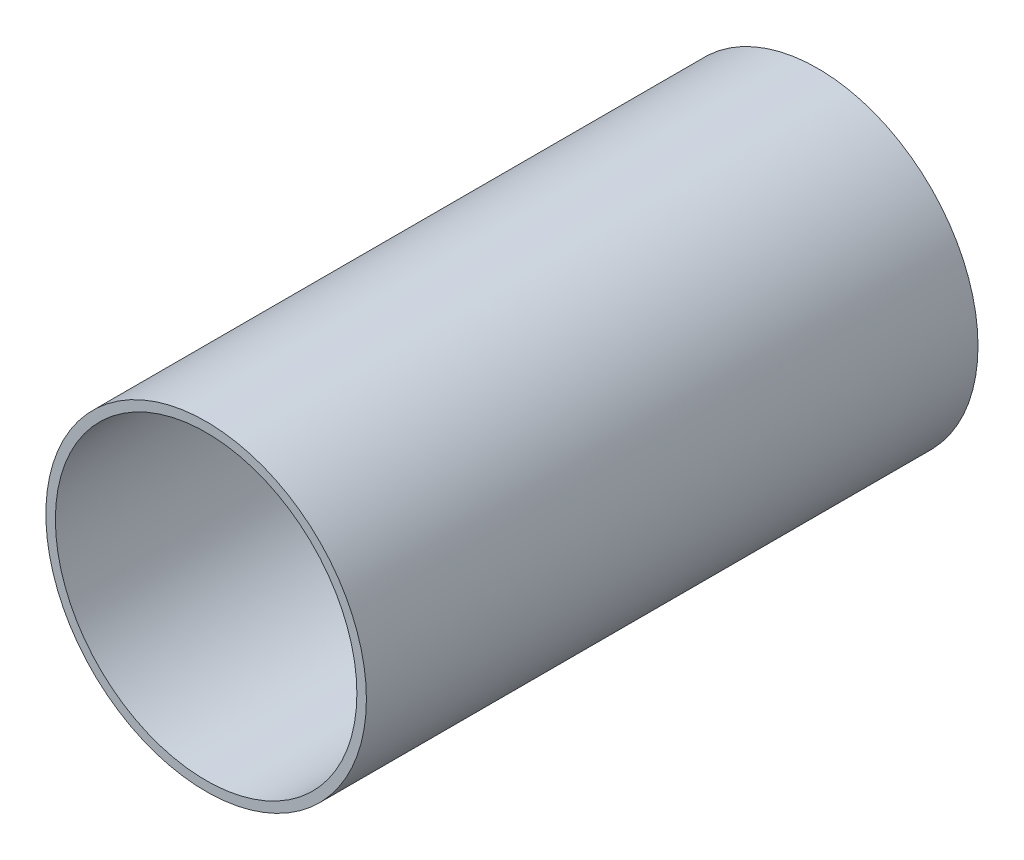
ISO-10303-21;
HEADER;
FILE_DESCRIPTION(('STEP AP214'),'2;1');
FILE_NAME('part.step','',(''),(''),'','','');
FILE_SCHEMA(('AUTOMOTIVE_DESIGN { 1 0 10303 214 1 1 1 1 }'));
ENDSEC;
DATA;
#1=APPLICATION_CONTEXT('core data for automotive mechanical design processes');
#2=APPLICATION_PROTOCOL_DEFINITION('international standard','automotive_design',2000,#1);
#3=PRODUCT_CONTEXT('',#1,'mechanical');
#4=PRODUCT('Part','Part','',(#3));
#5=PRODUCT_RELATED_PRODUCT_CATEGORY('part','',(#4));
#6=PRODUCT_DEFINITION_FORMATION('','',#4);
#7=PRODUCT_DEFINITION_CONTEXT('part definition',#1,'design');
#8=PRODUCT_DEFINITION('design','',#6,#7);
#9=PRODUCT_DEFINITION_SHAPE('','',#8);
#10=(LENGTH_UNIT() NAMED_UNIT(*) SI_UNIT(.MILLI.,.METRE.));
#11=(NAMED_UNIT(*) PLANE_ANGLE_UNIT() SI_UNIT($,.RADIAN.));
#12=(NAMED_UNIT(*) SI_UNIT($,.STERADIAN.) SOLID_ANGLE_UNIT());
#13=UNCERTAINTY_MEASURE_WITH_UNIT(LENGTH_MEASURE(1.E-05),#10,'distance_accuracy_value','');
#14=(GEOMETRIC_REPRESENTATION_CONTEXT(3) GLOBAL_UNCERTAINTY_ASSIGNED_CONTEXT((#13)) GLOBAL_UNIT_ASSIGNED_CONTEXT((#10,
#11,#12)) REPRESENTATION_CONTEXT('',''));
#15=CARTESIAN_POINT('',(0.,0.,0.));
#16=DIRECTION('',(0.,0.,1.));
#17=DIRECTION('',(1.,0.,0.));
#18=AXIS2_PLACEMENT_3D('',#15,#16,#17);
#19=CARTESIAN_POINT('',(0.,0.,0.));
#20=DIRECTION('',(0.,0.,1.));
#21=DIRECTION('',(1.,0.,0.));
#22=AXIS2_PLACEMENT_3D('',#19,#20,#21);
#23=CYLINDRICAL_SURFACE('',#22,47.499999996);
#24=CARTESIAN_POINT('',(0.,0.,192.6999999942));
#25=DIRECTION('',(0.,0.,1.));
#26=DIRECTION('',(1.,0.,0.));
#27=AXIS2_PLACEMENT_3D('',#24,#25,#26);
#28=CIRCLE('',#27,47.499999996);
#29=CARTESIAN_POINT('',(47.499999996,0.,192.6999999942));
#30=VERTEX_POINT('',#29);
#31=EDGE_CURVE('E18',#30,#30,#28,.F.);
#32=ORIENTED_EDGE('',*,*,#31,.F.);
#33=EDGE_LOOP('',(#32));
#34=FACE_BOUND('',#33,.T.);
#35=CARTESIAN_POINT('',(0.,0.,0.));
#36=DIRECTION('',(0.,0.,1.));
#37=DIRECTION('',(1.,0.,0.));
#38=AXIS2_PLACEMENT_3D('',#35,#36,#37);
#39=CIRCLE('',#38,47.499999996);
#40=CARTESIAN_POINT('',(47.499999996,0.,0.));
#41=VERTEX_POINT('',#40);
#42=EDGE_CURVE('E27',#41,#41,#39,.T.);
#43=ORIENTED_EDGE('',*,*,#42,.F.);
#44=EDGE_LOOP('',(#43));
#45=FACE_BOUND('',#44,.T.);
#46=ADVANCED_FACE('F14',(#34,#45),#23,.F.);
#47=CARTESIAN_POINT('',(-51.1059999976,-51.1059999976,192.6999999942));
#48=DIRECTION('',(0.,0.,1.));
#49=DIRECTION('',(1.,0.,0.));
#50=AXIS2_PLACEMENT_3D('',#47,#48,#49);
#51=PLANE('',#50);
#52=ORIENTED_EDGE('',*,*,#31,.T.);
#53=EDGE_LOOP('',(#52));
#54=FACE_BOUND('',#53,.T.);
#55=CARTESIAN_POINT('',(0.,0.,192.6999999942));
#56=DIRECTION('',(0.,0.,1.));
#57=DIRECTION('',(1.,0.,0.));
#58=AXIS2_PLACEMENT_3D('',#55,#56,#57);
#59=CIRCLE('',#58,50.4999999904);
#60=CARTESIAN_POINT('',(50.4999999904,0.,192.6999999942));
#61=VERTEX_POINT('',#60);
#62=EDGE_CURVE('E22',#61,#61,#59,.T.);
#63=ORIENTED_EDGE('',*,*,#62,.T.);
#64=EDGE_LOOP('',(#63));
#65=FACE_BOUND('',#64,.T.);
#66=ADVANCED_FACE('F35',(#54,#65),#51,.T.);
#67=CARTESIAN_POINT('',(51.1059999976,-51.1059999976,0.));
#68=DIRECTION('',(0.,0.,-1.));
#69=DIRECTION('',(-1.,0.,0.));
#70=AXIS2_PLACEMENT_3D('',#67,#68,#69);
#71=PLANE('',#70);
#72=ORIENTED_EDGE('',*,*,#42,.T.);
#73=EDGE_LOOP('',(#72));
#74=FACE_BOUND('',#73,.T.);
#75=CARTESIAN_POINT('',(0.,0.,0.));
#76=DIRECTION('',(0.,0.,1.));
#77=DIRECTION('',(1.,0.,0.));
#78=AXIS2_PLACEMENT_3D('',#75,#76,#77);
#79=CIRCLE('',#78,50.4999999904);
#80=CARTESIAN_POINT('',(50.4999999904,0.,0.));
#81=VERTEX_POINT('',#80);
#82=EDGE_CURVE('E10',#81,#81,#79,.F.);
#83=ORIENTED_EDGE('',*,*,#82,.T.);
#84=EDGE_LOOP('',(#83));
#85=FACE_BOUND('',#84,.T.);
#86=ADVANCED_FACE('F16',(#74,#85),#71,.T.);
#87=CARTESIAN_POINT('',(0.,0.,0.));
#88=DIRECTION('',(0.,0.,1.));
#89=DIRECTION('',(1.,0.,0.));
#90=AXIS2_PLACEMENT_3D('',#87,#88,#89);
#91=CYLINDRICAL_SURFACE('',#90,50.4999999904);
#92=ORIENTED_EDGE('',*,*,#62,.F.);
#93=EDGE_LOOP('',(#92));
#94=FACE_BOUND('',#93,.T.);
#95=ORIENTED_EDGE('',*,*,#82,.F.);
#96=EDGE_LOOP('',(#95));
#97=FACE_BOUND('',#96,.T.);
#98=ADVANCED_FACE('F46',(#94,#97),#91,.T.);
#99=CLOSED_SHELL('',(#46,#66,#86,#98));
#100=MANIFOLD_SOLID_BREP('B1',#99);
#101=ADVANCED_BREP_SHAPE_REPRESENTATION('',(#18,#100),#14);
#102=SHAPE_DEFINITION_REPRESENTATION(#9,#101);
ENDSEC;
END-ISO-10303-21;
